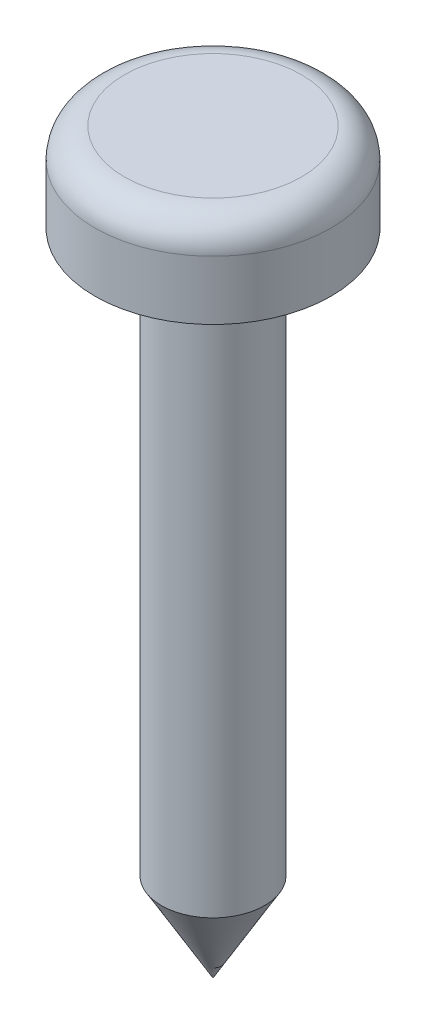
ISO-10303-21;
HEADER;
FILE_DESCRIPTION(('STEP AP214'),'2;1');
FILE_NAME('part.step','',(''),(''),'','','');
FILE_SCHEMA(('AUTOMOTIVE_DESIGN { 1 0 10303 214 1 1 1 1 }'));
ENDSEC;
DATA;
#1=APPLICATION_CONTEXT('core data for automotive mechanical design processes');
#2=APPLICATION_PROTOCOL_DEFINITION('international standard','automotive_design',2000,#1);
#3=PRODUCT_CONTEXT('',#1,'mechanical');
#4=PRODUCT('Part','Part','',(#3));
#5=PRODUCT_RELATED_PRODUCT_CATEGORY('part','',(#4));
#6=PRODUCT_DEFINITION_FORMATION('','',#4);
#7=PRODUCT_DEFINITION_CONTEXT('part definition',#1,'design');
#8=PRODUCT_DEFINITION('design','',#6,#7);
#9=PRODUCT_DEFINITION_SHAPE('','',#8);
#10=(LENGTH_UNIT() NAMED_UNIT(*) SI_UNIT(.MILLI.,.METRE.));
#11=(NAMED_UNIT(*) PLANE_ANGLE_UNIT() SI_UNIT($,.RADIAN.));
#12=(NAMED_UNIT(*) SI_UNIT($,.STERADIAN.) SOLID_ANGLE_UNIT());
#13=UNCERTAINTY_MEASURE_WITH_UNIT(LENGTH_MEASURE(1.E-05),#10,'distance_accuracy_value','');
#14=(GEOMETRIC_REPRESENTATION_CONTEXT(3) GLOBAL_UNCERTAINTY_ASSIGNED_CONTEXT((#13)) GLOBAL_UNIT_ASSIGNED_CONTEXT((#10,
#11,#12)) REPRESENTATION_CONTEXT('',''));
#15=CARTESIAN_POINT('',(0.,0.,0.));
#16=DIRECTION('',(0.,0.,1.));
#17=DIRECTION('',(1.,0.,0.));
#18=AXIS2_PLACEMENT_3D('',#15,#16,#17);
#19=CARTESIAN_POINT('',(0.,3.,0.));
#20=DIRECTION('',(0.,1.,0.));
#21=DIRECTION('',(0.,0.,1.));
#22=AXIS2_PLACEMENT_3D('',#19,#20,#21);
#23=CONICAL_SURFACE('',#22,1.75,0.528074448426359);
#24=CARTESIAN_POINT('',(0.,0.,0.));
#25=VERTEX_POINT('',#24);
#26=VERTEX_LOOP('',#25);
#27=FACE_BOUND('',#26,.T.);
#28=CARTESIAN_POINT('',(0.,3.,0.));
#29=DIRECTION('',(0.,1.,0.));
#30=DIRECTION('',(0.,0.,1.));
#31=AXIS2_PLACEMENT_3D('',#28,#29,#30);
#32=CIRCLE('',#31,1.75);
#33=CARTESIAN_POINT('',(0.,3.,1.75));
#34=VERTEX_POINT('',#33);
#35=EDGE_CURVE('E13',#34,#34,#32,.T.);
#36=ORIENTED_EDGE('',*,*,#35,.F.);
#37=EDGE_LOOP('',(#36));
#38=FACE_BOUND('',#37,.T.);
#39=ADVANCED_FACE('F42',(#27,#38),#23,.T.);
#40=CARTESIAN_POINT('',(0.,86.3157561862598,0.));
#41=DIRECTION('',(0.,1.,0.));
#42=DIRECTION('',(0.,0.,1.));
#43=AXIS2_PLACEMENT_3D('',#40,#41,#42);
#44=CYLINDRICAL_SURFACE('',#43,1.75);
#45=ORIENTED_EDGE('',*,*,#35,.T.);
#46=EDGE_LOOP('',(#45));
#47=FACE_BOUND('',#46,.T.);
#48=CARTESIAN_POINT('',(0.,22.,0.));
#49=DIRECTION('',(0.,1.,0.));
#50=DIRECTION('',(0.,0.,1.));
#51=AXIS2_PLACEMENT_3D('',#48,#49,#50);
#52=CIRCLE('',#51,1.75);
#53=CARTESIAN_POINT('',(0.,22.,1.75));
#54=VERTEX_POINT('',#53);
#55=EDGE_CURVE('E48',#54,#54,#52,.T.);
#56=ORIENTED_EDGE('',*,*,#55,.F.);
#57=EDGE_LOOP('',(#56));
#58=FACE_BOUND('',#57,.T.);
#59=ADVANCED_FACE('F53',(#47,#58),#44,.T.);
#60=CARTESIAN_POINT('',(-1.75,22.,0.));
#61=DIRECTION('',(0.,-1.,0.));
#62=DIRECTION('',(0.,0.,-1.));
#63=AXIS2_PLACEMENT_3D('',#60,#61,#62);
#64=PLANE('',#63);
#65=ORIENTED_EDGE('',*,*,#55,.T.);
#66=EDGE_LOOP('',(#65));
#67=FACE_BOUND('',#66,.T.);
#68=CARTESIAN_POINT('',(0.,22.,0.));
#69=DIRECTION('',(0.,1.,0.));
#70=DIRECTION('',(0.,0.,1.));
#71=AXIS2_PLACEMENT_3D('',#68,#69,#70);
#72=CIRCLE('',#71,3.99999999999999);
#73=CARTESIAN_POINT('',(0.,22.,3.99999999999999));
#74=VERTEX_POINT('',#73);
#75=EDGE_CURVE('E62',#74,#74,#72,.T.);
#76=ORIENTED_EDGE('',*,*,#75,.F.);
#77=EDGE_LOOP('',(#76));
#78=FACE_BOUND('',#77,.T.);
#79=ADVANCED_FACE('F58',(#67,#78),#64,.T.);
#80=CARTESIAN_POINT('',(0.,86.3157561862598,0.));
#81=DIRECTION('',(0.,1.,0.));
#82=DIRECTION('',(0.,0.,1.));
#83=AXIS2_PLACEMENT_3D('',#80,#81,#82);
#84=CYLINDRICAL_SURFACE('',#83,3.99999999999999);
#85=ORIENTED_EDGE('',*,*,#75,.T.);
#86=EDGE_LOOP('',(#85));
#87=FACE_BOUND('',#86,.T.);
#88=CARTESIAN_POINT('',(0.,24.,0.));
#89=DIRECTION('',(0.,1.,0.));
#90=DIRECTION('',(0.,0.,1.));
#91=AXIS2_PLACEMENT_3D('',#88,#89,#90);
#92=CIRCLE('',#91,4.);
#93=CARTESIAN_POINT('',(0.,24.,4.));
#94=VERTEX_POINT('',#93);
#95=EDGE_CURVE('E64',#94,#94,#92,.T.);
#96=ORIENTED_EDGE('',*,*,#95,.F.);
#97=EDGE_LOOP('',(#96));
#98=FACE_BOUND('',#97,.T.);
#99=ADVANCED_FACE('F77',(#87,#98),#84,.T.);
#100=CARTESIAN_POINT('',(0.,24.,0.));
#101=DIRECTION('',(0.,1.,0.));
#102=DIRECTION('',(0.,0.,1.));
#103=AXIS2_PLACEMENT_3D('',#100,#101,#102);
#104=TOROIDAL_SURFACE('',#103,3.,1.);
#105=ORIENTED_EDGE('',*,*,#95,.T.);
#106=EDGE_LOOP('',(#105));
#107=FACE_BOUND('',#106,.T.);
#108=CARTESIAN_POINT('',(0.,25.,0.));
#109=DIRECTION('',(0.,1.,0.));
#110=DIRECTION('',(0.,0.,1.));
#111=AXIS2_PLACEMENT_3D('',#108,#109,#110);
#112=CIRCLE('',#111,2.99999999999999);
#113=CARTESIAN_POINT('',(0.,25.,2.99999999999999));
#114=VERTEX_POINT('',#113);
#115=EDGE_CURVE('E69',#114,#114,#112,.T.);
#116=ORIENTED_EDGE('',*,*,#115,.F.);
#117=EDGE_LOOP('',(#116));
#118=FACE_BOUND('',#117,.T.);
#119=ADVANCED_FACE('F75',(#107,#118),#104,.T.);
#120=CARTESIAN_POINT('',(-2.99999999999999,25.,0.));
#121=DIRECTION('',(0.,1.,0.));
#122=DIRECTION('',(0.,0.,1.));
#123=AXIS2_PLACEMENT_3D('',#120,#121,#122);
#124=PLANE('',#123);
#125=ORIENTED_EDGE('',*,*,#115,.T.);
#126=EDGE_LOOP('',(#125));
#127=FACE_BOUND('',#126,.T.);
#128=ADVANCED_FACE('F73',(#127),#124,.T.);
#129=CLOSED_SHELL('',(#39,#59,#79,#99,#119,#128));
#130=MANIFOLD_SOLID_BREP('B2',#129);
#131=ADVANCED_BREP_SHAPE_REPRESENTATION('',(#18,#130),#14);
#132=SHAPE_DEFINITION_REPRESENTATION(#9,#131);
ENDSEC;
END-ISO-10303-21;
